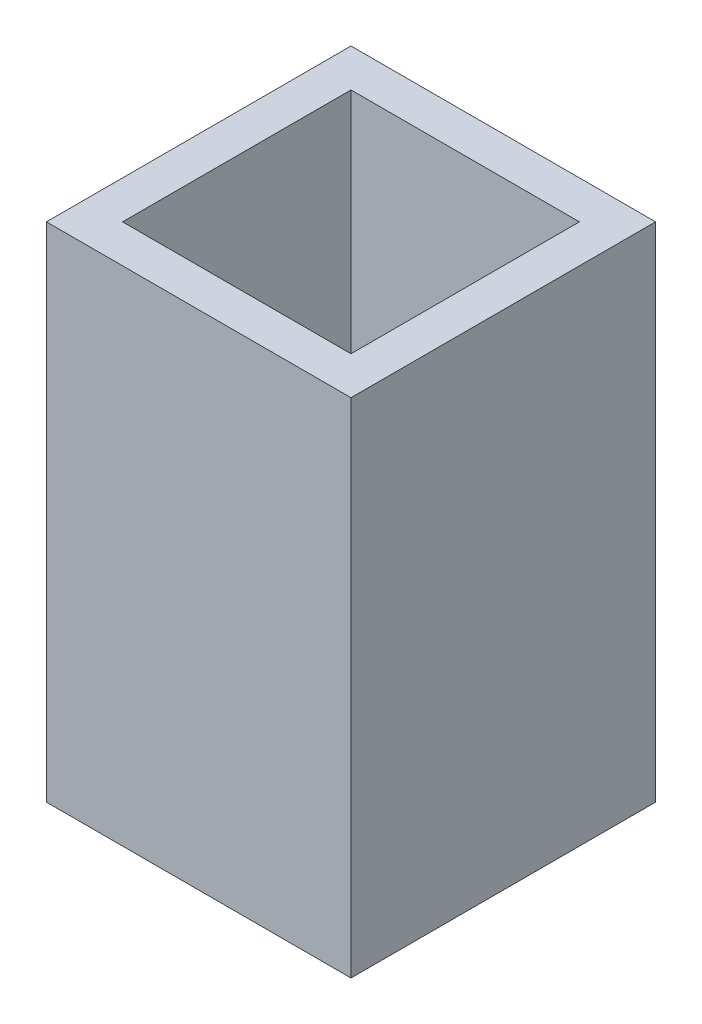
ISO-10303-21;
HEADER;
FILE_DESCRIPTION(('STEP AP214'),'2;1');
FILE_NAME('part.step','',(''),(''),'','','');
FILE_SCHEMA(('AUTOMOTIVE_DESIGN { 1 0 10303 214 1 1 1 1 }'));
ENDSEC;
DATA;
#1=APPLICATION_CONTEXT('core data for automotive mechanical design processes');
#2=APPLICATION_PROTOCOL_DEFINITION('international standard','automotive_design',2000,#1);
#3=PRODUCT_CONTEXT('',#1,'mechanical');
#4=PRODUCT('Part','Part','',(#3));
#5=PRODUCT_RELATED_PRODUCT_CATEGORY('part','',(#4));
#6=PRODUCT_DEFINITION_FORMATION('','',#4);
#7=PRODUCT_DEFINITION_CONTEXT('part definition',#1,'design');
#8=PRODUCT_DEFINITION('design','',#6,#7);
#9=PRODUCT_DEFINITION_SHAPE('','',#8);
#10=(LENGTH_UNIT() NAMED_UNIT(*) SI_UNIT(.MILLI.,.METRE.));
#11=(NAMED_UNIT(*) PLANE_ANGLE_UNIT() SI_UNIT($,.RADIAN.));
#12=(NAMED_UNIT(*) SI_UNIT($,.STERADIAN.) SOLID_ANGLE_UNIT());
#13=UNCERTAINTY_MEASURE_WITH_UNIT(LENGTH_MEASURE(1.E-05),#10,'distance_accuracy_value','');
#14=(GEOMETRIC_REPRESENTATION_CONTEXT(3) GLOBAL_UNCERTAINTY_ASSIGNED_CONTEXT((#13)) GLOBAL_UNIT_ASSIGNED_CONTEXT((#10,
#11,#12)) REPRESENTATION_CONTEXT('',''));
#15=CARTESIAN_POINT('',(0.,0.,0.));
#16=DIRECTION('',(0.,0.,1.));
#17=DIRECTION('',(1.,0.,0.));
#18=AXIS2_PLACEMENT_3D('',#15,#16,#17);
#19=CARTESIAN_POINT('',(0.,41.91,0.));
#20=DIRECTION('',(1.,0.,0.));
#21=DIRECTION('',(0.,0.,-1.));
#22=AXIS2_PLACEMENT_3D('',#19,#20,#21);
#23=PLANE('',#22);
#24=DIRECTION('',(0.,0.,1.));
#25=VECTOR('',#24,1.);
#26=CARTESIAN_POINT('',(0.,0.,0.));
#27=LINE('',#26,#25);
#28=CARTESIAN_POINT('',(0.,0.,-25.4));
#29=VERTEX_POINT('',#28);
#30=CARTESIAN_POINT('',(0.,0.,0.));
#31=VERTEX_POINT('',#30);
#32=EDGE_CURVE('E130',#29,#31,#27,.T.);
#33=ORIENTED_EDGE('',*,*,#32,.T.);
#34=DIRECTION('',(0.,-1.,0.));
#35=VECTOR('',#34,1.);
#36=CARTESIAN_POINT('',(0.,41.91,0.));
#37=LINE('',#36,#35);
#38=CARTESIAN_POINT('',(0.,41.91,0.));
#39=VERTEX_POINT('',#38);
#40=EDGE_CURVE('E11',#39,#31,#37,.T.);
#41=ORIENTED_EDGE('',*,*,#40,.F.);
#42=DIRECTION('',(0.,0.,1.));
#43=VECTOR('',#42,1.);
#44=CARTESIAN_POINT('',(0.,41.91,0.));
#45=LINE('',#44,#43);
#46=CARTESIAN_POINT('',(0.,41.91,-25.4));
#47=VERTEX_POINT('',#46);
#48=EDGE_CURVE('E134',#47,#39,#45,.T.);
#49=ORIENTED_EDGE('',*,*,#48,.F.);
#50=DIRECTION('',(0.,-1.,0.));
#51=VECTOR('',#50,1.);
#52=CARTESIAN_POINT('',(0.,41.91,-25.4));
#53=LINE('',#52,#51);
#54=EDGE_CURVE('E144',#47,#29,#53,.T.);
#55=ORIENTED_EDGE('',*,*,#54,.T.);
#56=EDGE_LOOP('',(#33,#41,#49,#55));
#57=FACE_BOUND('',#56,.T.);
#58=ADVANCED_FACE('F33',(#57),#23,.F.);
#59=CARTESIAN_POINT('',(0.,41.91,0.));
#60=DIRECTION('',(0.,0.,-1.));
#61=DIRECTION('',(-1.,0.,0.));
#62=AXIS2_PLACEMENT_3D('',#59,#60,#61);
#63=PLANE('',#62);
#64=DIRECTION('',(1.,0.,0.));
#65=VECTOR('',#64,1.);
#66=CARTESIAN_POINT('',(0.,0.,0.));
#67=LINE('',#66,#65);
#68=CARTESIAN_POINT('',(25.4,0.,0.));
#69=VERTEX_POINT('',#68);
#70=EDGE_CURVE('E147',#31,#69,#67,.T.);
#71=ORIENTED_EDGE('',*,*,#70,.T.);
#72=DIRECTION('',(0.,-1.,0.));
#73=VECTOR('',#72,1.);
#74=CARTESIAN_POINT('',(25.4,41.91,0.));
#75=LINE('',#74,#73);
#76=CARTESIAN_POINT('',(25.4,41.91,0.));
#77=VERTEX_POINT('',#76);
#78=EDGE_CURVE('E40',#77,#69,#75,.T.);
#79=ORIENTED_EDGE('',*,*,#78,.F.);
#80=DIRECTION('',(1.,0.,0.));
#81=VECTOR('',#80,1.);
#82=CARTESIAN_POINT('',(0.,41.91,0.));
#83=LINE('',#82,#81);
#84=EDGE_CURVE('E137',#39,#77,#83,.T.);
#85=ORIENTED_EDGE('',*,*,#84,.F.);
#86=ORIENTED_EDGE('',*,*,#40,.T.);
#87=EDGE_LOOP('',(#71,#79,#85,#86));
#88=FACE_BOUND('',#87,.T.);
#89=ADVANCED_FACE('F175',(#88),#63,.F.);
#90=CARTESIAN_POINT('',(25.4,41.91,0.));
#91=DIRECTION('',(-1.,0.,0.));
#92=DIRECTION('',(0.,0.,1.));
#93=AXIS2_PLACEMENT_3D('',#90,#91,#92);
#94=PLANE('',#93);
#95=DIRECTION('',(0.,0.,-1.));
#96=VECTOR('',#95,1.);
#97=CARTESIAN_POINT('',(25.4,0.,0.));
#98=LINE('',#97,#96);
#99=CARTESIAN_POINT('',(25.4,0.,-25.4));
#100=VERTEX_POINT('',#99);
#101=EDGE_CURVE('E149',#69,#100,#98,.T.);
#102=ORIENTED_EDGE('',*,*,#101,.T.);
#103=DIRECTION('',(0.,-1.,0.));
#104=VECTOR('',#103,1.);
#105=CARTESIAN_POINT('',(25.4,41.91,-25.4));
#106=LINE('',#105,#104);
#107=CARTESIAN_POINT('',(25.4,41.91,-25.4));
#108=VERTEX_POINT('',#107);
#109=EDGE_CURVE('E154',#108,#100,#106,.T.);
#110=ORIENTED_EDGE('',*,*,#109,.F.);
#111=DIRECTION('',(0.,0.,-1.));
#112=VECTOR('',#111,1.);
#113=CARTESIAN_POINT('',(25.4,41.91,0.));
#114=LINE('',#113,#112);
#115=EDGE_CURVE('E140',#77,#108,#114,.T.);
#116=ORIENTED_EDGE('',*,*,#115,.F.);
#117=ORIENTED_EDGE('',*,*,#78,.T.);
#118=EDGE_LOOP('',(#102,#110,#116,#117));
#119=FACE_BOUND('',#118,.T.);
#120=ADVANCED_FACE('F161',(#119),#94,.F.);
#121=CARTESIAN_POINT('',(0.,41.91,-25.4));
#122=DIRECTION('',(0.,0.,1.));
#123=DIRECTION('',(1.,0.,0.));
#124=AXIS2_PLACEMENT_3D('',#121,#122,#123);
#125=PLANE('',#124);
#126=DIRECTION('',(-1.,0.,0.));
#127=VECTOR('',#126,1.);
#128=CARTESIAN_POINT('',(0.,0.,-25.4));
#129=LINE('',#128,#127);
#130=EDGE_CURVE('E138',#100,#29,#129,.T.);
#131=ORIENTED_EDGE('',*,*,#130,.T.);
#132=ORIENTED_EDGE('',*,*,#54,.F.);
#133=DIRECTION('',(-1.,0.,0.));
#134=VECTOR('',#133,1.);
#135=CARTESIAN_POINT('',(0.,41.91,-25.4));
#136=LINE('',#135,#134);
#137=EDGE_CURVE('E142',#108,#47,#136,.T.);
#138=ORIENTED_EDGE('',*,*,#137,.F.);
#139=ORIENTED_EDGE('',*,*,#109,.T.);
#140=EDGE_LOOP('',(#131,#132,#138,#139));
#141=FACE_BOUND('',#140,.T.);
#142=ADVANCED_FACE('F170',(#141),#125,.F.);
#143=CARTESIAN_POINT('',(0.,41.91,0.));
#144=DIRECTION('',(0.,-1.,0.));
#145=DIRECTION('',(0.,0.,-1.));
#146=AXIS2_PLACEMENT_3D('',#143,#144,#145);
#147=PLANE('',#146);
#148=DIRECTION('',(1.,0.,0.));
#149=VECTOR('',#148,1.);
#150=CARTESIAN_POINT('',(22.225,41.91,-22.225));
#151=LINE('',#150,#149);
#152=CARTESIAN_POINT('',(3.175,41.91,-22.225));
#153=VERTEX_POINT('',#152);
#154=CARTESIAN_POINT('',(22.225,41.91,-22.225));
#155=VERTEX_POINT('',#154);
#156=EDGE_CURVE('E105',#153,#155,#151,.T.);
#157=ORIENTED_EDGE('',*,*,#156,.T.);
#158=DIRECTION('',(0.,0.,1.));
#159=VECTOR('',#158,1.);
#160=CARTESIAN_POINT('',(22.225,41.91,-3.175));
#161=LINE('',#160,#159);
#162=CARTESIAN_POINT('',(22.225,41.91,-3.175));
#163=VERTEX_POINT('',#162);
#164=EDGE_CURVE('E99',#155,#163,#161,.T.);
#165=ORIENTED_EDGE('',*,*,#164,.T.);
#166=DIRECTION('',(-1.,0.,0.));
#167=VECTOR('',#166,1.);
#168=CARTESIAN_POINT('',(22.225,41.91,-3.175));
#169=LINE('',#168,#167);
#170=CARTESIAN_POINT('',(3.175,41.91,-3.175));
#171=VERTEX_POINT('',#170);
#172=EDGE_CURVE('E108',#163,#171,#169,.T.);
#173=ORIENTED_EDGE('',*,*,#172,.T.);
#174=DIRECTION('',(0.,0.,-1.));
#175=VECTOR('',#174,1.);
#176=CARTESIAN_POINT('',(3.175,41.91,-3.175));
#177=LINE('',#176,#175);
#178=EDGE_CURVE('E47',#171,#153,#177,.T.);
#179=ORIENTED_EDGE('',*,*,#178,.T.);
#180=EDGE_LOOP('',(#157,#165,#173,#179));
#181=FACE_BOUND('',#180,.T.);
#182=ORIENTED_EDGE('',*,*,#48,.T.);
#183=ORIENTED_EDGE('',*,*,#84,.T.);
#184=ORIENTED_EDGE('',*,*,#115,.T.);
#185=ORIENTED_EDGE('',*,*,#137,.T.);
#186=EDGE_LOOP('',(#182,#183,#184,#185));
#187=FACE_BOUND('',#186,.T.);
#188=ADVANCED_FACE('F112',(#181,#187),#147,.F.);
#189=CARTESIAN_POINT('',(0.,0.,0.));
#190=DIRECTION('',(0.,-1.,0.));
#191=DIRECTION('',(0.,0.,-1.));
#192=AXIS2_PLACEMENT_3D('',#189,#190,#191);
#193=PLANE('',#192);
#194=DIRECTION('',(0.,0.,1.));
#195=VECTOR('',#194,1.);
#196=CARTESIAN_POINT('',(22.225,0.,-3.175));
#197=LINE('',#196,#195);
#198=CARTESIAN_POINT('',(22.225,0.,-22.225));
#199=VERTEX_POINT('',#198);
#200=CARTESIAN_POINT('',(22.225,0.,-3.175));
#201=VERTEX_POINT('',#200);
#202=EDGE_CURVE('E55',#199,#201,#197,.T.);
#203=ORIENTED_EDGE('',*,*,#202,.F.);
#204=DIRECTION('',(1.,0.,0.));
#205=VECTOR('',#204,1.);
#206=CARTESIAN_POINT('',(22.225,0.,-22.225));
#207=LINE('',#206,#205);
#208=CARTESIAN_POINT('',(3.175,0.,-22.225));
#209=VERTEX_POINT('',#208);
#210=EDGE_CURVE('E115',#209,#199,#207,.T.);
#211=ORIENTED_EDGE('',*,*,#210,.F.);
#212=DIRECTION('',(0.,0.,-1.));
#213=VECTOR('',#212,1.);
#214=CARTESIAN_POINT('',(3.175,0.,-3.175));
#215=LINE('',#214,#213);
#216=CARTESIAN_POINT('',(3.175,0.,-3.175));
#217=VERTEX_POINT('',#216);
#218=EDGE_CURVE('E118',#217,#209,#215,.T.);
#219=ORIENTED_EDGE('',*,*,#218,.F.);
#220=DIRECTION('',(-1.,0.,0.));
#221=VECTOR('',#220,1.);
#222=CARTESIAN_POINT('',(22.225,0.,-3.175));
#223=LINE('',#222,#221);
#224=EDGE_CURVE('E124',#201,#217,#223,.T.);
#225=ORIENTED_EDGE('',*,*,#224,.F.);
#226=EDGE_LOOP('',(#203,#211,#219,#225));
#227=FACE_BOUND('',#226,.T.);
#228=ORIENTED_EDGE('',*,*,#32,.F.);
#229=ORIENTED_EDGE('',*,*,#130,.F.);
#230=ORIENTED_EDGE('',*,*,#101,.F.);
#231=ORIENTED_EDGE('',*,*,#70,.F.);
#232=EDGE_LOOP('',(#228,#229,#230,#231));
#233=FACE_BOUND('',#232,.T.);
#234=ADVANCED_FACE('F167',(#227,#233),#193,.T.);
#235=CARTESIAN_POINT('',(22.225,41.91,-3.175));
#236=DIRECTION('',(1.,0.,0.));
#237=DIRECTION('',(0.,0.,-1.));
#238=AXIS2_PLACEMENT_3D('',#235,#236,#237);
#239=PLANE('',#238);
#240=ORIENTED_EDGE('',*,*,#202,.T.);
#241=DIRECTION('',(0.,-1.,0.));
#242=VECTOR('',#241,1.);
#243=CARTESIAN_POINT('',(22.225,41.91,-3.175));
#244=LINE('',#243,#242);
#245=EDGE_CURVE('E95',#163,#201,#244,.T.);
#246=ORIENTED_EDGE('',*,*,#245,.F.);
#247=ORIENTED_EDGE('',*,*,#164,.F.);
#248=DIRECTION('',(0.,-1.,0.));
#249=VECTOR('',#248,1.);
#250=CARTESIAN_POINT('',(22.225,41.91,-22.225));
#251=LINE('',#250,#249);
#252=EDGE_CURVE('E128',#155,#199,#251,.T.);
#253=ORIENTED_EDGE('',*,*,#252,.T.);
#254=EDGE_LOOP('',(#240,#246,#247,#253));
#255=FACE_BOUND('',#254,.T.);
#256=ADVANCED_FACE('F97',(#255),#239,.F.);
#257=CARTESIAN_POINT('',(22.225,41.91,-22.225));
#258=DIRECTION('',(0.,0.,-1.));
#259=DIRECTION('',(-1.,0.,0.));
#260=AXIS2_PLACEMENT_3D('',#257,#258,#259);
#261=PLANE('',#260);
#262=ORIENTED_EDGE('',*,*,#210,.T.);
#263=ORIENTED_EDGE('',*,*,#252,.F.);
#264=ORIENTED_EDGE('',*,*,#156,.F.);
#265=DIRECTION('',(0.,-1.,0.));
#266=VECTOR('',#265,1.);
#267=CARTESIAN_POINT('',(3.175,41.91,-22.225));
#268=LINE('',#267,#266);
#269=EDGE_CURVE('E131',#153,#209,#268,.T.);
#270=ORIENTED_EDGE('',*,*,#269,.T.);
#271=EDGE_LOOP('',(#262,#263,#264,#270));
#272=FACE_BOUND('',#271,.T.);
#273=ADVANCED_FACE('F192',(#272),#261,.F.);
#274=CARTESIAN_POINT('',(3.175,41.91,-3.175));
#275=DIRECTION('',(-1.,0.,0.));
#276=DIRECTION('',(0.,0.,1.));
#277=AXIS2_PLACEMENT_3D('',#274,#275,#276);
#278=PLANE('',#277);
#279=ORIENTED_EDGE('',*,*,#218,.T.);
#280=ORIENTED_EDGE('',*,*,#269,.F.);
#281=ORIENTED_EDGE('',*,*,#178,.F.);
#282=DIRECTION('',(0.,-1.,0.));
#283=VECTOR('',#282,1.);
#284=CARTESIAN_POINT('',(3.175,41.91,-3.175));
#285=LINE('',#284,#283);
#286=EDGE_CURVE('E104',#171,#217,#285,.T.);
#287=ORIENTED_EDGE('',*,*,#286,.T.);
#288=EDGE_LOOP('',(#279,#280,#281,#287));
#289=FACE_BOUND('',#288,.T.);
#290=ADVANCED_FACE('F195',(#289),#278,.F.);
#291=CARTESIAN_POINT('',(22.225,41.91,-3.175));
#292=DIRECTION('',(0.,0.,1.));
#293=DIRECTION('',(1.,0.,0.));
#294=AXIS2_PLACEMENT_3D('',#291,#292,#293);
#295=PLANE('',#294);
#296=ORIENTED_EDGE('',*,*,#224,.T.);
#297=ORIENTED_EDGE('',*,*,#286,.F.);
#298=ORIENTED_EDGE('',*,*,#172,.F.);
#299=ORIENTED_EDGE('',*,*,#245,.T.);
#300=EDGE_LOOP('',(#296,#297,#298,#299));
#301=FACE_BOUND('',#300,.T.);
#302=ADVANCED_FACE('F109',(#301),#295,.F.);
#303=CLOSED_SHELL('',(#58,#89,#120,#142,#188,#234,#256,#273,#290,#302));
#304=MANIFOLD_SOLID_BREP('B2',#303);
#305=ADVANCED_BREP_SHAPE_REPRESENTATION('',(#18,#304),#14);
#306=SHAPE_DEFINITION_REPRESENTATION(#9,#305);
ENDSEC;
END-ISO-10303-21;
